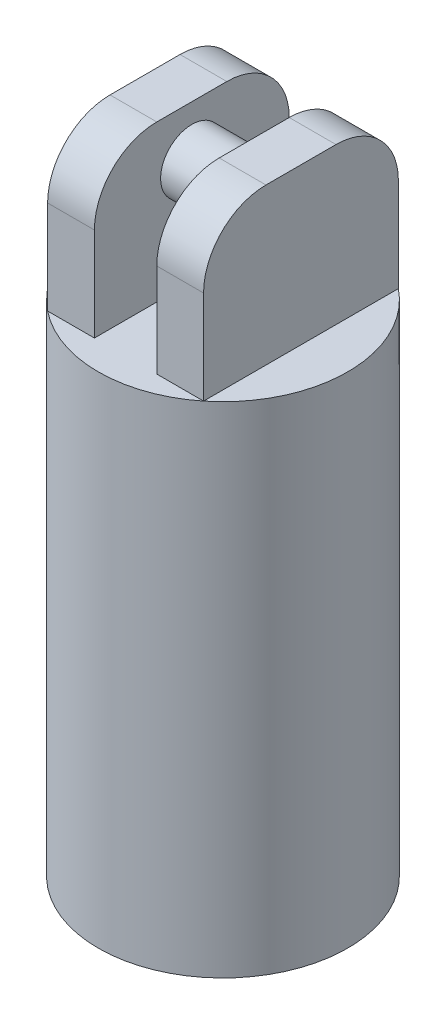
ISO-10303-21;
HEADER;
FILE_DESCRIPTION(('STEP AP214'),'2;1');
FILE_NAME('part.step','',(''),(''),'','','');
FILE_SCHEMA(('AUTOMOTIVE_DESIGN { 1 0 10303 214 1 1 1 1 }'));
ENDSEC;
DATA;
#1=APPLICATION_CONTEXT('core data for automotive mechanical design processes');
#2=APPLICATION_PROTOCOL_DEFINITION('international standard','automotive_design',2000,#1);
#3=PRODUCT_CONTEXT('',#1,'mechanical');
#4=PRODUCT('Part','Part','',(#3));
#5=PRODUCT_RELATED_PRODUCT_CATEGORY('part','',(#4));
#6=PRODUCT_DEFINITION_FORMATION('','',#4);
#7=PRODUCT_DEFINITION_CONTEXT('part definition',#1,'design');
#8=PRODUCT_DEFINITION('design','',#6,#7);
#9=PRODUCT_DEFINITION_SHAPE('','',#8);
#10=(LENGTH_UNIT() NAMED_UNIT(*) SI_UNIT(.MILLI.,.METRE.));
#11=(NAMED_UNIT(*) PLANE_ANGLE_UNIT() SI_UNIT($,.RADIAN.));
#12=(NAMED_UNIT(*) SI_UNIT($,.STERADIAN.) SOLID_ANGLE_UNIT());
#13=UNCERTAINTY_MEASURE_WITH_UNIT(LENGTH_MEASURE(1.E-05),#10,'distance_accuracy_value','');
#14=(GEOMETRIC_REPRESENTATION_CONTEXT(3) GLOBAL_UNCERTAINTY_ASSIGNED_CONTEXT((#13)) GLOBAL_UNIT_ASSIGNED_CONTEXT((#10,
#11,#12)) REPRESENTATION_CONTEXT('',''));
#15=CARTESIAN_POINT('',(0.,0.,0.));
#16=DIRECTION('',(0.,0.,1.));
#17=DIRECTION('',(1.,0.,0.));
#18=AXIS2_PLACEMENT_3D('',#15,#16,#17);
#19=CARTESIAN_POINT('',(-31.75,266.7,-39.6557372898298));
#20=DIRECTION('',(0.,0.,1.));
#21=DIRECTION('',(1.,0.,0.));
#22=AXIS2_PLACEMENT_3D('',#19,#20,#21);
#23=PLANE('',#22);
#24=DIRECTION('',(0.,1.,0.));
#25=VECTOR('',#24,1.);
#26=CARTESIAN_POINT('',(12.7,203.2,-39.6557372898298));
#27=LINE('',#26,#25);
#28=CARTESIAN_POINT('',(12.7,203.2,-39.6557372898298));
#29=VERTEX_POINT('',#28);
#30=CARTESIAN_POINT('',(12.7,241.3,-39.6557372898298));
#31=VERTEX_POINT('',#30);
#32=EDGE_CURVE('E136',#29,#31,#27,.T.);
#33=ORIENTED_EDGE('',*,*,#32,.T.);
#34=DIRECTION('',(-1.,0.,0.));
#35=VECTOR('',#34,1.);
#36=CARTESIAN_POINT('',(-31.75,241.3,-39.6557372898298));
#37=LINE('',#36,#35);
#38=CARTESIAN_POINT('',(31.75,241.3,-39.6557372898298));
#39=VERTEX_POINT('',#38);
#40=EDGE_CURVE('E72',#31,#39,#37,.F.);
#41=ORIENTED_EDGE('',*,*,#40,.T.);
#42=DIRECTION('',(0.,-1.,0.));
#43=VECTOR('',#42,1.);
#44=CARTESIAN_POINT('',(31.75,266.7,-39.6557372898298));
#45=LINE('',#44,#43);
#46=CARTESIAN_POINT('',(31.75,203.2,-39.6557372898298));
#47=VERTEX_POINT('',#46);
#48=EDGE_CURVE('E162',#39,#47,#45,.T.);
#49=ORIENTED_EDGE('',*,*,#48,.T.);
#50=DIRECTION('',(-1.,0.,0.));
#51=VECTOR('',#50,1.);
#52=CARTESIAN_POINT('',(-31.75,203.2,-39.6557372898298));
#53=LINE('',#52,#51);
#54=EDGE_CURVE('E154',#47,#29,#53,.T.);
#55=ORIENTED_EDGE('',*,*,#54,.T.);
#56=EDGE_LOOP('',(#33,#41,#49,#55));
#57=FACE_BOUND('',#56,.T.);
#58=ADVANCED_FACE('F47',(#57),#23,.F.);
#59=CARTESIAN_POINT('',(-31.75,266.7,39.6557372898298));
#60=DIRECTION('',(0.,0.,-1.));
#61=DIRECTION('',(-1.,0.,0.));
#62=AXIS2_PLACEMENT_3D('',#59,#60,#61);
#63=PLANE('',#62);
#64=DIRECTION('',(0.,-1.,0.));
#65=VECTOR('',#64,1.);
#66=CARTESIAN_POINT('',(31.75,266.7,39.6557372898298));
#67=LINE('',#66,#65);
#68=CARTESIAN_POINT('',(31.75,241.3,39.6557372898298));
#69=VERTEX_POINT('',#68);
#70=CARTESIAN_POINT('',(31.75,203.2,39.6557372898298));
#71=VERTEX_POINT('',#70);
#72=EDGE_CURVE('E181',#69,#71,#67,.T.);
#73=ORIENTED_EDGE('',*,*,#72,.F.);
#74=DIRECTION('',(1.,0.,0.));
#75=VECTOR('',#74,1.);
#76=CARTESIAN_POINT('',(-31.75,241.3,39.6557372898298));
#77=LINE('',#76,#75);
#78=CARTESIAN_POINT('',(12.7,241.3,39.6557372898298));
#79=VERTEX_POINT('',#78);
#80=EDGE_CURVE('E11',#69,#79,#77,.F.);
#81=ORIENTED_EDGE('',*,*,#80,.T.);
#82=DIRECTION('',(0.,1.,0.));
#83=VECTOR('',#82,1.);
#84=CARTESIAN_POINT('',(12.7,203.2,39.6557372898298));
#85=LINE('',#84,#83);
#86=CARTESIAN_POINT('',(12.7,203.2,39.6557372898298));
#87=VERTEX_POINT('',#86);
#88=EDGE_CURVE('E319',#87,#79,#85,.T.);
#89=ORIENTED_EDGE('',*,*,#88,.F.);
#90=DIRECTION('',(1.,0.,0.));
#91=VECTOR('',#90,1.);
#92=CARTESIAN_POINT('',(-31.75,203.2,39.6557372898298));
#93=LINE('',#92,#91);
#94=EDGE_CURVE('E158',#87,#71,#93,.T.);
#95=ORIENTED_EDGE('',*,*,#94,.T.);
#96=EDGE_LOOP('',(#73,#81,#89,#95));
#97=FACE_BOUND('',#96,.T.);
#98=ADVANCED_FACE('F272',(#97),#63,.F.);
#99=CARTESIAN_POINT('',(0.,266.7,0.));
#100=DIRECTION('',(0.,-1.,0.));
#101=DIRECTION('',(0.,0.,-1.));
#102=AXIS2_PLACEMENT_3D('',#99,#100,#101);
#103=PLANE('',#102);
#104=DIRECTION('',(0.,0.,-1.));
#105=VECTOR('',#104,1.);
#106=CARTESIAN_POINT('',(31.75,266.7,39.6557372898298));
#107=LINE('',#106,#105);
#108=CARTESIAN_POINT('',(31.75,266.7,14.2557372898298));
#109=VERTEX_POINT('',#108);
#110=CARTESIAN_POINT('',(31.75,266.7,-14.2557372898298));
#111=VERTEX_POINT('',#110);
#112=EDGE_CURVE('E180',#109,#111,#107,.T.);
#113=ORIENTED_EDGE('',*,*,#112,.T.);
#114=DIRECTION('',(-1.,0.,0.));
#115=VECTOR('',#114,1.);
#116=CARTESIAN_POINT('',(0.,266.7,-14.2557372898298));
#117=LINE('',#116,#115);
#118=CARTESIAN_POINT('',(12.7,266.7,-14.2557372898298));
#119=VERTEX_POINT('',#118);
#120=EDGE_CURVE('E233',#111,#119,#117,.T.);
#121=ORIENTED_EDGE('',*,*,#120,.T.);
#122=DIRECTION('',(0.,0.,-1.));
#123=VECTOR('',#122,1.);
#124=CARTESIAN_POINT('',(12.7,266.7,39.6557372898298));
#125=LINE('',#124,#123);
#126=CARTESIAN_POINT('',(12.7,266.7,14.2557372898298));
#127=VERTEX_POINT('',#126);
#128=EDGE_CURVE('E312',#127,#119,#125,.T.);
#129=ORIENTED_EDGE('',*,*,#128,.F.);
#130=DIRECTION('',(1.,0.,0.));
#131=VECTOR('',#130,1.);
#132=CARTESIAN_POINT('',(0.,266.7,14.2557372898298));
#133=LINE('',#132,#131);
#134=EDGE_CURVE('E229',#127,#109,#133,.T.);
#135=ORIENTED_EDGE('',*,*,#134,.T.);
#136=EDGE_LOOP('',(#113,#121,#129,#135));
#137=FACE_BOUND('',#136,.T.);
#138=ADVANCED_FACE('F254',(#137),#103,.F.);
#139=CARTESIAN_POINT('',(0.,203.2,0.));
#140=DIRECTION('',(0.,1.,0.));
#141=DIRECTION('',(0.,0.,1.));
#142=AXIS2_PLACEMENT_3D('',#139,#140,#141);
#143=PLANE('',#142);
#144=DIRECTION('',(0.,0.,-1.));
#145=VECTOR('',#144,1.);
#146=CARTESIAN_POINT('',(31.75,203.2,39.6557372898298));
#147=LINE('',#146,#145);
#148=EDGE_CURVE('E172',#71,#47,#147,.T.);
#149=ORIENTED_EDGE('',*,*,#148,.F.);
#150=CARTESIAN_POINT('',(0.,203.2,0.));
#151=DIRECTION('',(0.,1.,0.));
#152=DIRECTION('',(0.,0.,1.));
#153=AXIS2_PLACEMENT_3D('',#150,#151,#152);
#154=CIRCLE('',#153,50.8);
#155=EDGE_CURVE('E194',#71,#47,#154,.T.);
#156=ORIENTED_EDGE('',*,*,#155,.T.);
#157=EDGE_LOOP('',(#149,#156));
#158=FACE_BOUND('',#157,.T.);
#159=ADVANCED_FACE('F350',(#158),#143,.T.);
#160=DIRECTION('',(0.,0.,1.));
#161=VECTOR('',#160,1.);
#162=CARTESIAN_POINT('',(-31.75,203.2,39.6557372898298));
#163=LINE('',#162,#161);
#164=CARTESIAN_POINT('',(-31.75,203.2,-39.6557372898298));
#165=VERTEX_POINT('',#164);
#166=CARTESIAN_POINT('',(-31.75,203.2,39.6557372898298));
#167=VERTEX_POINT('',#166);
#168=EDGE_CURVE('E164',#165,#167,#163,.T.);
#169=ORIENTED_EDGE('',*,*,#168,.F.);
#170=EDGE_CURVE('E341',#165,#167,#154,.T.);
#171=ORIENTED_EDGE('',*,*,#170,.T.);
#172=EDGE_LOOP('',(#169,#171));
#173=FACE_BOUND('',#172,.T.);
#174=ADVANCED_FACE('F345',(#173),#143,.T.);
#175=CARTESIAN_POINT('',(0.,203.2,0.));
#176=DIRECTION('',(0.,-1.,0.));
#177=DIRECTION('',(0.,0.,-1.));
#178=AXIS2_PLACEMENT_3D('',#175,#176,#177);
#179=CYLINDRICAL_SURFACE('',#178,50.8);
#180=ORIENTED_EDGE('',*,*,#155,.F.);
#181=EDGE_CURVE('E200',#167,#71,#154,.T.);
#182=ORIENTED_EDGE('',*,*,#181,.F.);
#183=ORIENTED_EDGE('',*,*,#170,.F.);
#184=EDGE_CURVE('E199',#47,#165,#154,.T.);
#185=ORIENTED_EDGE('',*,*,#184,.F.);
#186=EDGE_LOOP('',(#180,#182,#183,#185));
#187=FACE_BOUND('',#186,.T.);
#188=CARTESIAN_POINT('',(0.,0.,0.));
#189=DIRECTION('',(0.,1.,0.));
#190=DIRECTION('',(0.,0.,1.));
#191=AXIS2_PLACEMENT_3D('',#188,#189,#190);
#192=CIRCLE('',#191,50.8);
#193=CARTESIAN_POINT('',(0.,0.,50.8));
#194=VERTEX_POINT('',#193);
#195=EDGE_CURVE('E193',#194,#194,#192,.T.);
#196=ORIENTED_EDGE('',*,*,#195,.T.);
#197=EDGE_LOOP('',(#196));
#198=FACE_BOUND('',#197,.T.);
#199=ADVANCED_FACE('F339',(#187,#198),#179,.T.);
#200=ORIENTED_EDGE('',*,*,#54,.F.);
#201=ORIENTED_EDGE('',*,*,#184,.T.);
#202=CARTESIAN_POINT('',(-12.7,203.2,-39.6557372898298));
#203=VERTEX_POINT('',#202);
#204=EDGE_CURVE('E165',#203,#165,#53,.T.);
#205=ORIENTED_EDGE('',*,*,#204,.F.);
#206=DIRECTION('',(0.,0.,1.));
#207=VECTOR('',#206,1.);
#208=CARTESIAN_POINT('',(-12.7,203.2,39.6557372898298));
#209=LINE('',#208,#207);
#210=CARTESIAN_POINT('',(-12.7,203.2,39.6557372898298));
#211=VERTEX_POINT('',#210);
#212=EDGE_CURVE('E147',#203,#211,#209,.T.);
#213=ORIENTED_EDGE('',*,*,#212,.T.);
#214=EDGE_CURVE('E176',#167,#211,#93,.T.);
#215=ORIENTED_EDGE('',*,*,#214,.F.);
#216=ORIENTED_EDGE('',*,*,#181,.T.);
#217=ORIENTED_EDGE('',*,*,#94,.F.);
#218=DIRECTION('',(0.,0.,-1.));
#219=VECTOR('',#218,1.);
#220=CARTESIAN_POINT('',(12.7,203.2,39.6557372898298));
#221=LINE('',#220,#219);
#222=EDGE_CURVE('E141',#87,#29,#221,.T.);
#223=ORIENTED_EDGE('',*,*,#222,.T.);
#224=EDGE_LOOP('',(#200,#201,#205,#213,#215,#216,#217,#223));
#225=FACE_BOUND('',#224,.T.);
#226=ADVANCED_FACE('F152',(#225),#143,.T.);
#227=CARTESIAN_POINT('',(0.,0.,0.));
#228=DIRECTION('',(0.,1.,0.));
#229=DIRECTION('',(0.,0.,1.));
#230=AXIS2_PLACEMENT_3D('',#227,#228,#229);
#231=PLANE('',#230);
#232=CARTESIAN_POINT('',(0.,0.,0.));
#233=DIRECTION('',(0.,-1.,0.));
#234=DIRECTION('',(0.,0.,-1.));
#235=AXIS2_PLACEMENT_3D('',#232,#233,#234);
#236=CIRCLE('',#235,31.75);
#237=CARTESIAN_POINT('',(0.,0.,-31.75));
#238=VERTEX_POINT('',#237);
#239=EDGE_CURVE('E354',#238,#238,#236,.T.);
#240=ORIENTED_EDGE('',*,*,#239,.F.);
#241=EDGE_LOOP('',(#240));
#242=FACE_BOUND('',#241,.T.);
#243=ORIENTED_EDGE('',*,*,#195,.F.);
#244=EDGE_LOOP('',(#243));
#245=FACE_BOUND('',#244,.T.);
#246=ADVANCED_FACE('F293',(#242,#245),#231,.F.);
#247=CARTESIAN_POINT('',(31.75,266.7,39.6557372898298));
#248=DIRECTION('',(-1.,0.,0.));
#249=DIRECTION('',(0.,0.,1.));
#250=AXIS2_PLACEMENT_3D('',#247,#248,#249);
#251=PLANE('',#250);
#252=ORIENTED_EDGE('',*,*,#48,.F.);
#253=CARTESIAN_POINT('',(31.75,241.3,-14.2557372898298));
#254=DIRECTION('',(-1.,0.,0.));
#255=DIRECTION('',(0.,0.,1.));
#256=AXIS2_PLACEMENT_3D('',#253,#254,#255);
#257=CIRCLE('',#256,25.4);
#258=EDGE_CURVE('E57',#39,#111,#257,.F.);
#259=ORIENTED_EDGE('',*,*,#258,.T.);
#260=ORIENTED_EDGE('',*,*,#112,.F.);
#261=CARTESIAN_POINT('',(31.75,241.3,14.2557372898298));
#262=DIRECTION('',(-1.,0.,0.));
#263=DIRECTION('',(0.,0.,1.));
#264=AXIS2_PLACEMENT_3D('',#261,#262,#263);
#265=CIRCLE('',#264,25.4);
#266=EDGE_CURVE('E64',#109,#69,#265,.F.);
#267=ORIENTED_EDGE('',*,*,#266,.T.);
#268=ORIENTED_EDGE('',*,*,#72,.T.);
#269=ORIENTED_EDGE('',*,*,#148,.T.);
#270=EDGE_LOOP('',(#252,#259,#260,#267,#268,#269));
#271=FACE_BOUND('',#270,.T.);
#272=ADVANCED_FACE('F249',(#271),#251,.F.);
#273=DIRECTION('',(0.,-1.,0.));
#274=VECTOR('',#273,1.);
#275=CARTESIAN_POINT('',(-31.75,266.7,-39.6557372898298));
#276=LINE('',#275,#274);
#277=CARTESIAN_POINT('',(-31.75,241.3,-39.6557372898298));
#278=VERTEX_POINT('',#277);
#279=EDGE_CURVE('E188',#278,#165,#276,.T.);
#280=ORIENTED_EDGE('',*,*,#279,.F.);
#281=DIRECTION('',(-1.,0.,0.));
#282=VECTOR('',#281,1.);
#283=CARTESIAN_POINT('',(-31.75,241.3,-39.6557372898298));
#284=LINE('',#283,#282);
#285=CARTESIAN_POINT('',(-12.7,241.3,-39.6557372898298));
#286=VERTEX_POINT('',#285);
#287=EDGE_CURVE('E217',#278,#286,#284,.F.);
#288=ORIENTED_EDGE('',*,*,#287,.T.);
#289=DIRECTION('',(0.,1.,0.));
#290=VECTOR('',#289,1.);
#291=CARTESIAN_POINT('',(-12.7,203.2,-39.6557372898298));
#292=LINE('',#291,#290);
#293=EDGE_CURVE('E146',#203,#286,#292,.T.);
#294=ORIENTED_EDGE('',*,*,#293,.F.);
#295=ORIENTED_EDGE('',*,*,#204,.T.);
#296=EDGE_LOOP('',(#280,#288,#294,#295));
#297=FACE_BOUND('',#296,.T.);
#298=ADVANCED_FACE('F274',(#297),#23,.F.);
#299=CARTESIAN_POINT('',(-31.75,266.7,39.6557372898298));
#300=DIRECTION('',(1.,0.,0.));
#301=DIRECTION('',(0.,0.,-1.));
#302=AXIS2_PLACEMENT_3D('',#299,#300,#301);
#303=PLANE('',#302);
#304=DIRECTION('',(0.,0.,1.));
#305=VECTOR('',#304,1.);
#306=CARTESIAN_POINT('',(-31.75,266.7,39.6557372898298));
#307=LINE('',#306,#305);
#308=CARTESIAN_POINT('',(-31.75,266.7,-14.2557372898298));
#309=VERTEX_POINT('',#308);
#310=CARTESIAN_POINT('',(-31.75,266.7,14.2557372898298));
#311=VERTEX_POINT('',#310);
#312=EDGE_CURVE('E185',#309,#311,#307,.T.);
#313=ORIENTED_EDGE('',*,*,#312,.F.);
#314=CARTESIAN_POINT('',(-31.75,241.3,-14.2557372898298));
#315=DIRECTION('',(1.,0.,0.));
#316=DIRECTION('',(0.,0.,-1.));
#317=AXIS2_PLACEMENT_3D('',#314,#315,#316);
#318=CIRCLE('',#317,25.4);
#319=EDGE_CURVE('E214',#309,#278,#318,.F.);
#320=ORIENTED_EDGE('',*,*,#319,.T.);
#321=ORIENTED_EDGE('',*,*,#279,.T.);
#322=ORIENTED_EDGE('',*,*,#168,.T.);
#323=DIRECTION('',(0.,-1.,0.));
#324=VECTOR('',#323,1.);
#325=CARTESIAN_POINT('',(-31.75,266.7,39.6557372898298));
#326=LINE('',#325,#324);
#327=CARTESIAN_POINT('',(-31.75,241.3,39.6557372898298));
#328=VERTEX_POINT('',#327);
#329=EDGE_CURVE('E184',#328,#167,#326,.T.);
#330=ORIENTED_EDGE('',*,*,#329,.F.);
#331=CARTESIAN_POINT('',(-31.75,241.3,14.2557372898298));
#332=DIRECTION('',(1.,0.,0.));
#333=DIRECTION('',(0.,0.,-1.));
#334=AXIS2_PLACEMENT_3D('',#331,#332,#333);
#335=CIRCLE('',#334,25.4);
#336=EDGE_CURVE('E211',#328,#311,#335,.F.);
#337=ORIENTED_EDGE('',*,*,#336,.T.);
#338=EDGE_LOOP('',(#313,#320,#321,#322,#330,#337));
#339=FACE_BOUND('',#338,.T.);
#340=ADVANCED_FACE('F285',(#339),#303,.F.);
#341=DIRECTION('',(0.,1.,0.));
#342=VECTOR('',#341,1.);
#343=CARTESIAN_POINT('',(-12.7,203.2,39.6557372898298));
#344=LINE('',#343,#342);
#345=CARTESIAN_POINT('',(-12.7,241.3,39.6557372898298));
#346=VERTEX_POINT('',#345);
#347=EDGE_CURVE('E322',#211,#346,#344,.T.);
#348=ORIENTED_EDGE('',*,*,#347,.T.);
#349=DIRECTION('',(1.,0.,0.));
#350=VECTOR('',#349,1.);
#351=CARTESIAN_POINT('',(-31.75,241.3,39.6557372898298));
#352=LINE('',#351,#350);
#353=EDGE_CURVE('E226',#346,#328,#352,.F.);
#354=ORIENTED_EDGE('',*,*,#353,.T.);
#355=ORIENTED_EDGE('',*,*,#329,.T.);
#356=ORIENTED_EDGE('',*,*,#214,.T.);
#357=EDGE_LOOP('',(#348,#354,#355,#356));
#358=FACE_BOUND('',#357,.T.);
#359=ADVANCED_FACE('F281',(#358),#63,.F.);
#360=DIRECTION('',(0.,0.,1.));
#361=VECTOR('',#360,1.);
#362=CARTESIAN_POINT('',(-12.7,266.7,39.6557372898298));
#363=LINE('',#362,#361);
#364=CARTESIAN_POINT('',(-12.7,266.7,-14.2557372898298));
#365=VERTEX_POINT('',#364);
#366=CARTESIAN_POINT('',(-12.7,266.7,14.2557372898298));
#367=VERTEX_POINT('',#366);
#368=EDGE_CURVE('E160',#365,#367,#363,.T.);
#369=ORIENTED_EDGE('',*,*,#368,.F.);
#370=DIRECTION('',(-1.,0.,0.));
#371=VECTOR('',#370,1.);
#372=CARTESIAN_POINT('',(0.,266.7,-14.2557372898298));
#373=LINE('',#372,#371);
#374=EDGE_CURVE('E207',#365,#309,#373,.T.);
#375=ORIENTED_EDGE('',*,*,#374,.T.);
#376=ORIENTED_EDGE('',*,*,#312,.T.);
#377=DIRECTION('',(1.,0.,0.));
#378=VECTOR('',#377,1.);
#379=CARTESIAN_POINT('',(0.,266.7,14.2557372898298));
#380=LINE('',#379,#378);
#381=EDGE_CURVE('E198',#311,#367,#380,.T.);
#382=ORIENTED_EDGE('',*,*,#381,.T.);
#383=EDGE_LOOP('',(#369,#375,#376,#382));
#384=FACE_BOUND('',#383,.T.);
#385=ADVANCED_FACE('F307',(#384),#103,.F.);
#386=CARTESIAN_POINT('',(12.7,203.2,39.6557372898298));
#387=DIRECTION('',(1.,0.,0.));
#388=DIRECTION('',(0.,0.,-1.));
#389=AXIS2_PLACEMENT_3D('',#386,#387,#388);
#390=PLANE('',#389);
#391=CARTESIAN_POINT('',(12.7,245.99349704648,0.));
#392=DIRECTION('',(1.,0.,0.));
#393=DIRECTION('',(0.,0.,-1.));
#394=AXIS2_PLACEMENT_3D('',#391,#392,#393);
#395=CIRCLE('',#394,12.7);
#396=CARTESIAN_POINT('',(12.7,245.99349704648,-12.7));
#397=VERTEX_POINT('',#396);
#398=EDGE_CURVE('E358',#397,#397,#395,.T.);
#399=ORIENTED_EDGE('',*,*,#398,.T.);
#400=EDGE_LOOP('',(#399));
#401=FACE_BOUND('',#400,.T.);
#402=ORIENTED_EDGE('',*,*,#128,.T.);
#403=CARTESIAN_POINT('',(12.7,241.3,-14.2557372898298));
#404=DIRECTION('',(1.,0.,0.));
#405=DIRECTION('',(0.,0.,-1.));
#406=AXIS2_PLACEMENT_3D('',#403,#404,#405);
#407=CIRCLE('',#406,25.4);
#408=EDGE_CURVE('E143',#119,#31,#407,.F.);
#409=ORIENTED_EDGE('',*,*,#408,.T.);
#410=ORIENTED_EDGE('',*,*,#32,.F.);
#411=ORIENTED_EDGE('',*,*,#222,.F.);
#412=ORIENTED_EDGE('',*,*,#88,.T.);
#413=CARTESIAN_POINT('',(12.7,241.3,14.2557372898298));
#414=DIRECTION('',(1.,0.,0.));
#415=DIRECTION('',(0.,0.,-1.));
#416=AXIS2_PLACEMENT_3D('',#413,#414,#415);
#417=CIRCLE('',#416,25.4);
#418=EDGE_CURVE('E237',#79,#127,#417,.F.);
#419=ORIENTED_EDGE('',*,*,#418,.T.);
#420=EDGE_LOOP('',(#402,#409,#410,#411,#412,#419));
#421=FACE_BOUND('',#420,.T.);
#422=ADVANCED_FACE('F139',(#401,#421),#390,.F.);
#423=CARTESIAN_POINT('',(-12.7,203.2,39.6557372898298));
#424=DIRECTION('',(-1.,0.,0.));
#425=DIRECTION('',(0.,0.,1.));
#426=AXIS2_PLACEMENT_3D('',#423,#424,#425);
#427=PLANE('',#426);
#428=CARTESIAN_POINT('',(-12.7,245.99349704648,0.));
#429=DIRECTION('',(-1.,0.,0.));
#430=DIRECTION('',(0.,0.,1.));
#431=AXIS2_PLACEMENT_3D('',#428,#429,#430);
#432=CIRCLE('',#431,12.7);
#433=CARTESIAN_POINT('',(-12.7,245.99349704648,12.7));
#434=VERTEX_POINT('',#433);
#435=EDGE_CURVE('E51',#434,#434,#432,.T.);
#436=ORIENTED_EDGE('',*,*,#435,.T.);
#437=EDGE_LOOP('',(#436));
#438=FACE_BOUND('',#437,.T.);
#439=ORIENTED_EDGE('',*,*,#293,.T.);
#440=CARTESIAN_POINT('',(-12.7,241.3,-14.2557372898298));
#441=DIRECTION('',(-1.,0.,0.));
#442=DIRECTION('',(0.,0.,1.));
#443=AXIS2_PLACEMENT_3D('',#440,#441,#442);
#444=CIRCLE('',#443,25.4);
#445=EDGE_CURVE('E223',#286,#365,#444,.F.);
#446=ORIENTED_EDGE('',*,*,#445,.T.);
#447=ORIENTED_EDGE('',*,*,#368,.T.);
#448=CARTESIAN_POINT('',(-12.7,241.3,14.2557372898298));
#449=DIRECTION('',(-1.,0.,0.));
#450=DIRECTION('',(0.,0.,1.));
#451=AXIS2_PLACEMENT_3D('',#448,#449,#450);
#452=CIRCLE('',#451,25.4);
#453=EDGE_CURVE('E220',#367,#346,#452,.F.);
#454=ORIENTED_EDGE('',*,*,#453,.T.);
#455=ORIENTED_EDGE('',*,*,#347,.F.);
#456=ORIENTED_EDGE('',*,*,#212,.F.);
#457=EDGE_LOOP('',(#439,#446,#447,#454,#455,#456));
#458=FACE_BOUND('',#457,.T.);
#459=ADVANCED_FACE('F305',(#438,#458),#427,.F.);
#460=CARTESIAN_POINT('',(0.,241.3,-14.2557372898298));
#461=DIRECTION('',(-1.,0.,0.));
#462=DIRECTION('',(0.,0.,1.));
#463=AXIS2_PLACEMENT_3D('',#460,#461,#462);
#464=CYLINDRICAL_SURFACE('',#463,25.4);
#465=ORIENTED_EDGE('',*,*,#445,.F.);
#466=ORIENTED_EDGE('',*,*,#287,.F.);
#467=ORIENTED_EDGE('',*,*,#319,.F.);
#468=ORIENTED_EDGE('',*,*,#374,.F.);
#469=EDGE_LOOP('',(#465,#466,#467,#468));
#470=FACE_BOUND('',#469,.T.);
#471=ADVANCED_FACE('F268',(#470),#464,.T.);
#472=CARTESIAN_POINT('',(0.,241.3,14.2557372898298));
#473=DIRECTION('',(1.,0.,0.));
#474=DIRECTION('',(0.,0.,-1.));
#475=AXIS2_PLACEMENT_3D('',#472,#473,#474);
#476=CYLINDRICAL_SURFACE('',#475,25.4);
#477=ORIENTED_EDGE('',*,*,#336,.F.);
#478=ORIENTED_EDGE('',*,*,#353,.F.);
#479=ORIENTED_EDGE('',*,*,#453,.F.);
#480=ORIENTED_EDGE('',*,*,#381,.F.);
#481=EDGE_LOOP('',(#477,#478,#479,#480));
#482=FACE_BOUND('',#481,.T.);
#483=ADVANCED_FACE('F261',(#482),#476,.T.);
#484=CARTESIAN_POINT('',(0.,241.3,-14.2557372898298));
#485=DIRECTION('',(-1.,0.,0.));
#486=DIRECTION('',(0.,0.,1.));
#487=AXIS2_PLACEMENT_3D('',#484,#485,#486);
#488=CYLINDRICAL_SURFACE('',#487,25.4);
#489=ORIENTED_EDGE('',*,*,#258,.F.);
#490=ORIENTED_EDGE('',*,*,#40,.F.);
#491=ORIENTED_EDGE('',*,*,#408,.F.);
#492=ORIENTED_EDGE('',*,*,#120,.F.);
#493=EDGE_LOOP('',(#489,#490,#491,#492));
#494=FACE_BOUND('',#493,.T.);
#495=ADVANCED_FACE('F259',(#494),#488,.T.);
#496=CARTESIAN_POINT('',(0.,241.3,14.2557372898298));
#497=DIRECTION('',(1.,0.,0.));
#498=DIRECTION('',(0.,0.,-1.));
#499=AXIS2_PLACEMENT_3D('',#496,#497,#498);
#500=CYLINDRICAL_SURFACE('',#499,25.4);
#501=ORIENTED_EDGE('',*,*,#418,.F.);
#502=ORIENTED_EDGE('',*,*,#80,.F.);
#503=ORIENTED_EDGE('',*,*,#266,.F.);
#504=ORIENTED_EDGE('',*,*,#134,.F.);
#505=EDGE_LOOP('',(#501,#502,#503,#504));
#506=FACE_BOUND('',#505,.T.);
#507=ADVANCED_FACE('F49',(#506),#500,.T.);
#508=CARTESIAN_POINT('',(0.,63.5,0.));
#509=DIRECTION('',(0.,-1.,0.));
#510=DIRECTION('',(0.,0.,-1.));
#511=AXIS2_PLACEMENT_3D('',#508,#509,#510);
#512=CYLINDRICAL_SURFACE('',#511,31.75);
#513=CARTESIAN_POINT('',(0.,63.5,0.));
#514=DIRECTION('',(0.,-1.,0.));
#515=DIRECTION('',(0.,0.,-1.));
#516=AXIS2_PLACEMENT_3D('',#513,#514,#515);
#517=CIRCLE('',#516,31.75);
#518=CARTESIAN_POINT('',(0.,63.5,-31.75));
#519=VERTEX_POINT('',#518);
#520=EDGE_CURVE('E315',#519,#519,#517,.T.);
#521=ORIENTED_EDGE('',*,*,#520,.F.);
#522=EDGE_LOOP('',(#521));
#523=FACE_BOUND('',#522,.T.);
#524=ORIENTED_EDGE('',*,*,#239,.T.);
#525=EDGE_LOOP('',(#524));
#526=FACE_BOUND('',#525,.T.);
#527=ADVANCED_FACE('F266',(#523,#526),#512,.F.);
#528=CARTESIAN_POINT('',(0.,63.5,0.));
#529=DIRECTION('',(0.,-1.,0.));
#530=DIRECTION('',(0.,0.,-1.));
#531=AXIS2_PLACEMENT_3D('',#528,#529,#530);
#532=PLANE('',#531);
#533=ORIENTED_EDGE('',*,*,#520,.T.);
#534=EDGE_LOOP('',(#533));
#535=FACE_BOUND('',#534,.T.);
#536=ADVANCED_FACE('F374',(#535),#532,.T.);
#537=CARTESIAN_POINT('',(-21.59,245.99349704648,0.));
#538=DIRECTION('',(1.,0.,0.));
#539=DIRECTION('',(0.,0.,-1.));
#540=AXIS2_PLACEMENT_3D('',#537,#538,#539);
#541=CYLINDRICAL_SURFACE('',#540,12.7);
#542=ORIENTED_EDGE('',*,*,#435,.F.);
#543=EDGE_LOOP('',(#542));
#544=FACE_BOUND('',#543,.T.);
#545=ORIENTED_EDGE('',*,*,#398,.F.);
#546=EDGE_LOOP('',(#545));
#547=FACE_BOUND('',#546,.T.);
#548=ADVANCED_FACE('F371',(#544,#547),#541,.T.);
#549=CLOSED_SHELL('',(#58,#98,#138,#159,#174,#199,#226,#246,#272,#298,#340,#359,#385,#422,#459,
#471,#483,#495,#507,#527,#536,#548));
#550=MANIFOLD_SOLID_BREP('B2',#549);
#551=ADVANCED_BREP_SHAPE_REPRESENTATION('',(#18,#550),#14);
#552=SHAPE_DEFINITION_REPRESENTATION(#9,#551);
ENDSEC;
END-ISO-10303-21;
